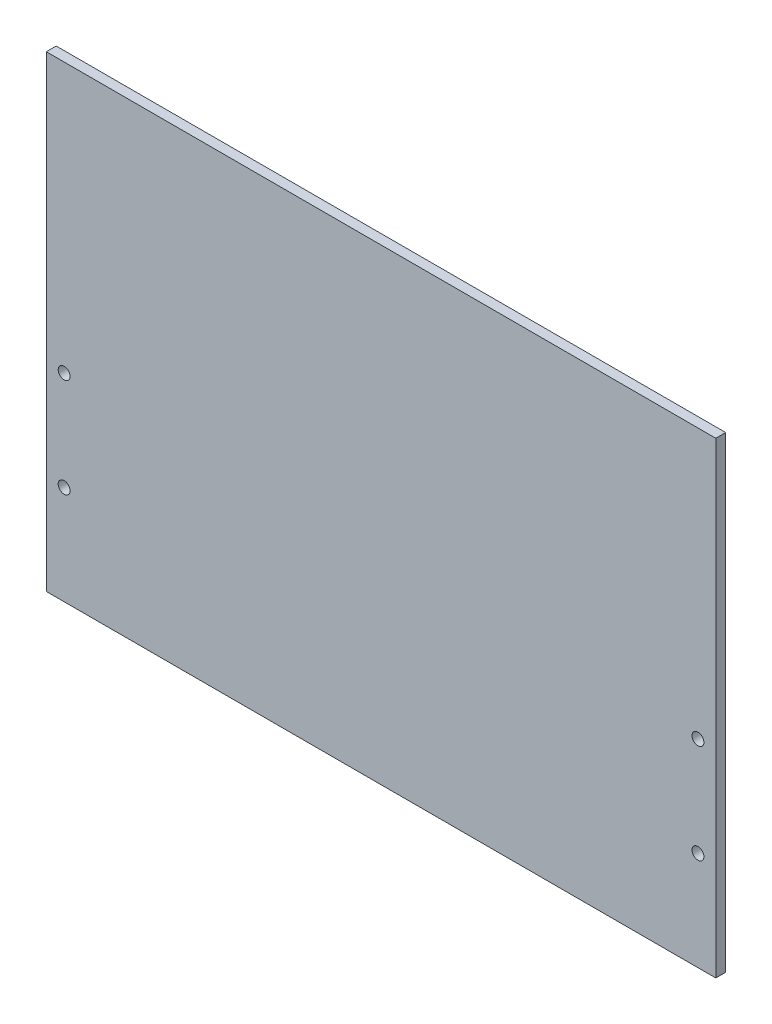
ISO-10303-21;
HEADER;
FILE_DESCRIPTION(('STEP AP214'),'2;1');
FILE_NAME('part.step','',(''),(''),'','','');
FILE_SCHEMA(('AUTOMOTIVE_DESIGN { 1 0 10303 214 1 1 1 1 }'));
ENDSEC;
DATA;
#1=APPLICATION_CONTEXT('core data for automotive mechanical design processes');
#2=APPLICATION_PROTOCOL_DEFINITION('international standard','automotive_design',2000,#1);
#3=PRODUCT_CONTEXT('',#1,'mechanical');
#4=PRODUCT('Part','Part','',(#3));
#5=PRODUCT_RELATED_PRODUCT_CATEGORY('part','',(#4));
#6=PRODUCT_DEFINITION_FORMATION('','',#4);
#7=PRODUCT_DEFINITION_CONTEXT('part definition',#1,'design');
#8=PRODUCT_DEFINITION('design','',#6,#7);
#9=PRODUCT_DEFINITION_SHAPE('','',#8);
#10=(LENGTH_UNIT() NAMED_UNIT(*) SI_UNIT(.MILLI.,.METRE.));
#11=(NAMED_UNIT(*) PLANE_ANGLE_UNIT() SI_UNIT($,.RADIAN.));
#12=(NAMED_UNIT(*) SI_UNIT($,.STERADIAN.) SOLID_ANGLE_UNIT());
#13=UNCERTAINTY_MEASURE_WITH_UNIT(LENGTH_MEASURE(1.E-05),#10,'distance_accuracy_value','');
#14=(GEOMETRIC_REPRESENTATION_CONTEXT(3) GLOBAL_UNCERTAINTY_ASSIGNED_CONTEXT((#13)) GLOBAL_UNIT_ASSIGNED_CONTEXT((#10,
#11,#12)) REPRESENTATION_CONTEXT('',''));
#15=CARTESIAN_POINT('',(0.,0.,0.));
#16=DIRECTION('',(0.,0.,1.));
#17=DIRECTION('',(1.,0.,0.));
#18=AXIS2_PLACEMENT_3D('',#15,#16,#17);
#19=CARTESIAN_POINT('',(0.,0.,5.));
#20=DIRECTION('',(0.,0.,-1.));
#21=DIRECTION('',(-1.,0.,0.));
#22=AXIS2_PLACEMENT_3D('',#19,#20,#21);
#23=PLANE('',#22);
#24=DIRECTION('',(0.,1.,0.));
#25=VECTOR('',#24,1.);
#26=CARTESIAN_POINT('',(169.,-118.,5.));
#27=LINE('',#26,#25);
#28=CARTESIAN_POINT('',(169.,-118.,5.));
#29=VERTEX_POINT('',#28);
#30=CARTESIAN_POINT('',(169.,118.,5.));
#31=VERTEX_POINT('',#30);
#32=EDGE_CURVE('E89',#29,#31,#27,.T.);
#33=ORIENTED_EDGE('',*,*,#32,.T.);
#34=DIRECTION('',(-1.,0.,0.));
#35=VECTOR('',#34,1.);
#36=CARTESIAN_POINT('',(-169.,118.,5.));
#37=LINE('',#36,#35);
#38=CARTESIAN_POINT('',(-169.,118.,5.));
#39=VERTEX_POINT('',#38);
#40=EDGE_CURVE('E84',#31,#39,#37,.T.);
#41=ORIENTED_EDGE('',*,*,#40,.T.);
#42=DIRECTION('',(0.,-1.,0.));
#43=VECTOR('',#42,1.);
#44=CARTESIAN_POINT('',(-169.,-118.,5.));
#45=LINE('',#44,#43);
#46=CARTESIAN_POINT('',(-169.,-118.,5.));
#47=VERTEX_POINT('',#46);
#48=EDGE_CURVE('E87',#39,#47,#45,.T.);
#49=ORIENTED_EDGE('',*,*,#48,.T.);
#50=DIRECTION('',(1.,0.,0.));
#51=VECTOR('',#50,1.);
#52=CARTESIAN_POINT('',(-169.,-118.,5.));
#53=LINE('',#52,#51);
#54=EDGE_CURVE('E54',#47,#29,#53,.T.);
#55=ORIENTED_EDGE('',*,*,#54,.T.);
#56=EDGE_LOOP('',(#33,#41,#49,#55));
#57=FACE_BOUND('',#56,.T.);
#58=CARTESIAN_POINT('',(-160.,-68.,5.));
#59=DIRECTION('',(0.,0.,1.));
#60=DIRECTION('',(1.,0.,0.));
#61=AXIS2_PLACEMENT_3D('',#58,#59,#60);
#62=CIRCLE('',#61,2.99999999999999);
#63=CARTESIAN_POINT('',(-157.,-68.,5.));
#64=VERTEX_POINT('',#63);
#65=EDGE_CURVE('E104',#64,#64,#62,.T.);
#66=ORIENTED_EDGE('',*,*,#65,.F.);
#67=EDGE_LOOP('',(#66));
#68=FACE_BOUND('',#67,.T.);
#69=CARTESIAN_POINT('',(-160.,-18.,5.));
#70=DIRECTION('',(0.,0.,1.));
#71=DIRECTION('',(1.,0.,0.));
#72=AXIS2_PLACEMENT_3D('',#69,#70,#71);
#73=CIRCLE('',#72,2.99999999999999);
#74=CARTESIAN_POINT('',(-157.,-18.,5.));
#75=VERTEX_POINT('',#74);
#76=EDGE_CURVE('E119',#75,#75,#73,.T.);
#77=ORIENTED_EDGE('',*,*,#76,.F.);
#78=EDGE_LOOP('',(#77));
#79=FACE_BOUND('',#78,.T.);
#80=CARTESIAN_POINT('',(160.,-18.,5.));
#81=DIRECTION('',(0.,0.,1.));
#82=DIRECTION('',(1.,0.,0.));
#83=AXIS2_PLACEMENT_3D('',#80,#81,#82);
#84=CIRCLE('',#83,2.99999999999999);
#85=CARTESIAN_POINT('',(163.,-18.,5.));
#86=VERTEX_POINT('',#85);
#87=EDGE_CURVE('E125',#86,#86,#84,.T.);
#88=ORIENTED_EDGE('',*,*,#87,.F.);
#89=EDGE_LOOP('',(#88));
#90=FACE_BOUND('',#89,.T.);
#91=CARTESIAN_POINT('',(160.,-68.,5.));
#92=DIRECTION('',(0.,0.,1.));
#93=DIRECTION('',(1.,0.,0.));
#94=AXIS2_PLACEMENT_3D('',#91,#92,#93);
#95=CIRCLE('',#94,2.99999999999999);
#96=CARTESIAN_POINT('',(163.,-68.,5.));
#97=VERTEX_POINT('',#96);
#98=EDGE_CURVE('E131',#97,#97,#95,.T.);
#99=ORIENTED_EDGE('',*,*,#98,.F.);
#100=EDGE_LOOP('',(#99));
#101=FACE_BOUND('',#100,.T.);
#102=ADVANCED_FACE('F37',(#57,#68,#79,#90,#101),#23,.F.);
#103=CARTESIAN_POINT('',(0.,0.,0.));
#104=DIRECTION('',(0.,0.,-1.));
#105=DIRECTION('',(-1.,0.,0.));
#106=AXIS2_PLACEMENT_3D('',#103,#104,#105);
#107=PLANE('',#106);
#108=CARTESIAN_POINT('',(160.,-18.,0.));
#109=DIRECTION('',(0.,0.,1.));
#110=DIRECTION('',(1.,0.,0.));
#111=AXIS2_PLACEMENT_3D('',#108,#109,#110);
#112=CIRCLE('',#111,2.99999999999999);
#113=CARTESIAN_POINT('',(163.,-18.,0.));
#114=VERTEX_POINT('',#113);
#115=EDGE_CURVE('E128',#114,#114,#112,.T.);
#116=ORIENTED_EDGE('',*,*,#115,.T.);
#117=EDGE_LOOP('',(#116));
#118=FACE_BOUND('',#117,.T.);
#119=CARTESIAN_POINT('',(-160.,-68.,0.));
#120=DIRECTION('',(0.,0.,1.));
#121=DIRECTION('',(1.,0.,0.));
#122=AXIS2_PLACEMENT_3D('',#119,#120,#121);
#123=CIRCLE('',#122,2.99999999999999);
#124=CARTESIAN_POINT('',(-157.,-68.,0.));
#125=VERTEX_POINT('',#124);
#126=EDGE_CURVE('E116',#125,#125,#123,.T.);
#127=ORIENTED_EDGE('',*,*,#126,.T.);
#128=EDGE_LOOP('',(#127));
#129=FACE_BOUND('',#128,.T.);
#130=DIRECTION('',(0.,1.,0.));
#131=VECTOR('',#130,1.);
#132=CARTESIAN_POINT('',(169.,-118.,0.));
#133=LINE('',#132,#131);
#134=CARTESIAN_POINT('',(169.,-118.,0.));
#135=VERTEX_POINT('',#134);
#136=CARTESIAN_POINT('',(169.,118.,0.));
#137=VERTEX_POINT('',#136);
#138=EDGE_CURVE('E101',#135,#137,#133,.T.);
#139=ORIENTED_EDGE('',*,*,#138,.F.);
#140=DIRECTION('',(1.,0.,0.));
#141=VECTOR('',#140,1.);
#142=CARTESIAN_POINT('',(-169.,-118.,0.));
#143=LINE('',#142,#141);
#144=CARTESIAN_POINT('',(-169.,-118.,0.));
#145=VERTEX_POINT('',#144);
#146=EDGE_CURVE('E77',#145,#135,#143,.T.);
#147=ORIENTED_EDGE('',*,*,#146,.F.);
#148=DIRECTION('',(0.,-1.,0.));
#149=VECTOR('',#148,1.);
#150=CARTESIAN_POINT('',(-169.,-118.,0.));
#151=LINE('',#150,#149);
#152=CARTESIAN_POINT('',(-169.,118.,0.));
#153=VERTEX_POINT('',#152);
#154=EDGE_CURVE('E71',#153,#145,#151,.T.);
#155=ORIENTED_EDGE('',*,*,#154,.F.);
#156=DIRECTION('',(-1.,0.,0.));
#157=VECTOR('',#156,1.);
#158=CARTESIAN_POINT('',(-169.,118.,0.));
#159=LINE('',#158,#157);
#160=EDGE_CURVE('E93',#137,#153,#159,.T.);
#161=ORIENTED_EDGE('',*,*,#160,.F.);
#162=EDGE_LOOP('',(#139,#147,#155,#161));
#163=FACE_BOUND('',#162,.T.);
#164=CARTESIAN_POINT('',(-160.,-18.,0.));
#165=DIRECTION('',(0.,0.,1.));
#166=DIRECTION('',(1.,0.,0.));
#167=AXIS2_PLACEMENT_3D('',#164,#165,#166);
#168=CIRCLE('',#167,2.99999999999999);
#169=CARTESIAN_POINT('',(-157.,-18.,0.));
#170=VERTEX_POINT('',#169);
#171=EDGE_CURVE('E122',#170,#170,#168,.T.);
#172=ORIENTED_EDGE('',*,*,#171,.T.);
#173=EDGE_LOOP('',(#172));
#174=FACE_BOUND('',#173,.T.);
#175=CARTESIAN_POINT('',(160.,-68.,0.));
#176=DIRECTION('',(0.,0.,1.));
#177=DIRECTION('',(1.,0.,0.));
#178=AXIS2_PLACEMENT_3D('',#175,#176,#177);
#179=CIRCLE('',#178,2.99999999999999);
#180=CARTESIAN_POINT('',(163.,-68.,0.));
#181=VERTEX_POINT('',#180);
#182=EDGE_CURVE('E134',#181,#181,#179,.T.);
#183=ORIENTED_EDGE('',*,*,#182,.T.);
#184=EDGE_LOOP('',(#183));
#185=FACE_BOUND('',#184,.T.);
#186=ADVANCED_FACE('F112',(#118,#129,#163,#174,#185),#107,.T.);
#187=CARTESIAN_POINT('',(169.,-118.,5.));
#188=DIRECTION('',(-1.,0.,0.));
#189=DIRECTION('',(0.,0.,1.));
#190=AXIS2_PLACEMENT_3D('',#187,#188,#189);
#191=PLANE('',#190);
#192=ORIENTED_EDGE('',*,*,#138,.T.);
#193=DIRECTION('',(0.,0.,-1.));
#194=VECTOR('',#193,1.);
#195=CARTESIAN_POINT('',(169.,118.,5.));
#196=LINE('',#195,#194);
#197=EDGE_CURVE('E11',#31,#137,#196,.T.);
#198=ORIENTED_EDGE('',*,*,#197,.F.);
#199=ORIENTED_EDGE('',*,*,#32,.F.);
#200=DIRECTION('',(0.,0.,-1.));
#201=VECTOR('',#200,1.);
#202=CARTESIAN_POINT('',(169.,-118.,5.));
#203=LINE('',#202,#201);
#204=EDGE_CURVE('E97',#29,#135,#203,.T.);
#205=ORIENTED_EDGE('',*,*,#204,.T.);
#206=EDGE_LOOP('',(#192,#198,#199,#205));
#207=FACE_BOUND('',#206,.T.);
#208=ADVANCED_FACE('F39',(#207),#191,.F.);
#209=CARTESIAN_POINT('',(-169.,118.,5.));
#210=DIRECTION('',(0.,-1.,0.));
#211=DIRECTION('',(1.,0.,0.));
#212=AXIS2_PLACEMENT_3D('',#209,#210,#211);
#213=PLANE('',#212);
#214=ORIENTED_EDGE('',*,*,#160,.T.);
#215=DIRECTION('',(0.,0.,-1.));
#216=VECTOR('',#215,1.);
#217=CARTESIAN_POINT('',(-169.,118.,5.));
#218=LINE('',#217,#216);
#219=EDGE_CURVE('E46',#39,#153,#218,.T.);
#220=ORIENTED_EDGE('',*,*,#219,.F.);
#221=ORIENTED_EDGE('',*,*,#40,.F.);
#222=ORIENTED_EDGE('',*,*,#197,.T.);
#223=EDGE_LOOP('',(#214,#220,#221,#222));
#224=FACE_BOUND('',#223,.T.);
#225=ADVANCED_FACE('F92',(#224),#213,.F.);
#226=CARTESIAN_POINT('',(-169.,-118.,5.));
#227=DIRECTION('',(1.,0.,0.));
#228=DIRECTION('',(0.,0.,-1.));
#229=AXIS2_PLACEMENT_3D('',#226,#227,#228);
#230=PLANE('',#229);
#231=ORIENTED_EDGE('',*,*,#154,.T.);
#232=DIRECTION('',(0.,0.,-1.));
#233=VECTOR('',#232,1.);
#234=CARTESIAN_POINT('',(-169.,-118.,5.));
#235=LINE('',#234,#233);
#236=EDGE_CURVE('E94',#47,#145,#235,.T.);
#237=ORIENTED_EDGE('',*,*,#236,.F.);
#238=ORIENTED_EDGE('',*,*,#48,.F.);
#239=ORIENTED_EDGE('',*,*,#219,.T.);
#240=EDGE_LOOP('',(#231,#237,#238,#239));
#241=FACE_BOUND('',#240,.T.);
#242=ADVANCED_FACE('F95',(#241),#230,.F.);
#243=CARTESIAN_POINT('',(-169.,-118.,5.));
#244=DIRECTION('',(0.,1.,0.));
#245=DIRECTION('',(-1.,0.,0.));
#246=AXIS2_PLACEMENT_3D('',#243,#244,#245);
#247=PLANE('',#246);
#248=ORIENTED_EDGE('',*,*,#146,.T.);
#249=ORIENTED_EDGE('',*,*,#204,.F.);
#250=ORIENTED_EDGE('',*,*,#54,.F.);
#251=ORIENTED_EDGE('',*,*,#236,.T.);
#252=EDGE_LOOP('',(#248,#249,#250,#251));
#253=FACE_BOUND('',#252,.T.);
#254=ADVANCED_FACE('F109',(#253),#247,.F.);
#255=CARTESIAN_POINT('',(-160.,-68.,5.));
#256=DIRECTION('',(0.,0.,-1.));
#257=DIRECTION('',(-1.,0.,0.));
#258=AXIS2_PLACEMENT_3D('',#255,#256,#257);
#259=CYLINDRICAL_SURFACE('',#258,2.99999999999999);
#260=ORIENTED_EDGE('',*,*,#65,.T.);
#261=EDGE_LOOP('',(#260));
#262=FACE_BOUND('',#261,.T.);
#263=ORIENTED_EDGE('',*,*,#126,.F.);
#264=EDGE_LOOP('',(#263));
#265=FACE_BOUND('',#264,.T.);
#266=ADVANCED_FACE('F151',(#262,#265),#259,.F.);
#267=CARTESIAN_POINT('',(-160.,-18.,5.));
#268=DIRECTION('',(0.,0.,-1.));
#269=DIRECTION('',(-1.,0.,0.));
#270=AXIS2_PLACEMENT_3D('',#267,#268,#269);
#271=CYLINDRICAL_SURFACE('',#270,2.99999999999999);
#272=ORIENTED_EDGE('',*,*,#76,.T.);
#273=EDGE_LOOP('',(#272));
#274=FACE_BOUND('',#273,.T.);
#275=ORIENTED_EDGE('',*,*,#171,.F.);
#276=EDGE_LOOP('',(#275));
#277=FACE_BOUND('',#276,.T.);
#278=ADVANCED_FACE('F205',(#274,#277),#271,.F.);
#279=CARTESIAN_POINT('',(160.,-18.,5.));
#280=DIRECTION('',(0.,0.,-1.));
#281=DIRECTION('',(-1.,0.,0.));
#282=AXIS2_PLACEMENT_3D('',#279,#280,#281);
#283=CYLINDRICAL_SURFACE('',#282,2.99999999999999);
#284=ORIENTED_EDGE('',*,*,#87,.T.);
#285=EDGE_LOOP('',(#284));
#286=FACE_BOUND('',#285,.T.);
#287=ORIENTED_EDGE('',*,*,#115,.F.);
#288=EDGE_LOOP('',(#287));
#289=FACE_BOUND('',#288,.T.);
#290=ADVANCED_FACE('F214',(#286,#289),#283,.F.);
#291=CARTESIAN_POINT('',(160.,-68.,5.));
#292=DIRECTION('',(0.,0.,-1.));
#293=DIRECTION('',(-1.,0.,0.));
#294=AXIS2_PLACEMENT_3D('',#291,#292,#293);
#295=CYLINDRICAL_SURFACE('',#294,2.99999999999999);
#296=ORIENTED_EDGE('',*,*,#98,.T.);
#297=EDGE_LOOP('',(#296));
#298=FACE_BOUND('',#297,.T.);
#299=ORIENTED_EDGE('',*,*,#182,.F.);
#300=EDGE_LOOP('',(#299));
#301=FACE_BOUND('',#300,.T.);
#302=ADVANCED_FACE('F140',(#298,#301),#295,.F.);
#303=CLOSED_SHELL('',(#102,#186,#208,#225,#242,#254,#266,#278,#290,#302));
#304=MANIFOLD_SOLID_BREP('B2',#303);
#305=ADVANCED_BREP_SHAPE_REPRESENTATION('',(#18,#304),#14);
#306=SHAPE_DEFINITION_REPRESENTATION(#9,#305);
ENDSEC;
END-ISO-10303-21;
